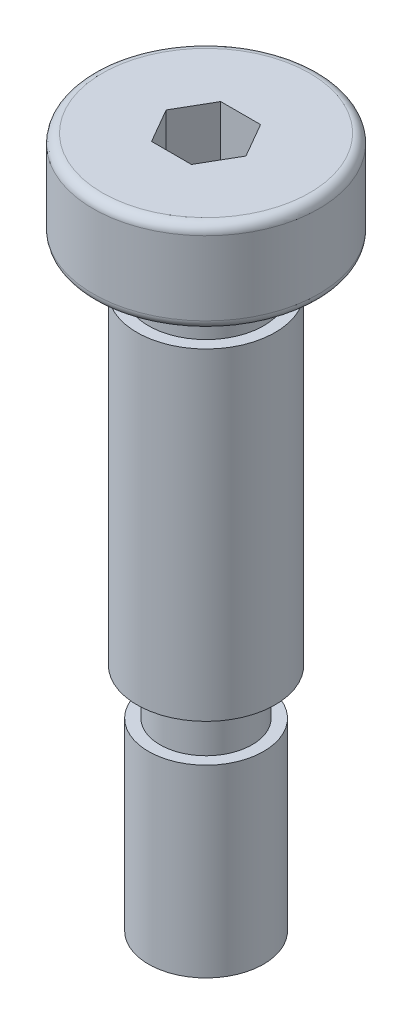
ISO-10303-21;
HEADER;
FILE_DESCRIPTION(('STEP AP214'),'2;1');
FILE_NAME('part.step','',(''),(''),'','','');
FILE_SCHEMA(('AUTOMOTIVE_DESIGN { 1 0 10303 214 1 1 1 1 }'));
ENDSEC;
DATA;
#1=APPLICATION_CONTEXT('core data for automotive mechanical design processes');
#2=APPLICATION_PROTOCOL_DEFINITION('international standard','automotive_design',2000,#1);
#3=PRODUCT_CONTEXT('',#1,'mechanical');
#4=PRODUCT('Part','Part','',(#3));
#5=PRODUCT_RELATED_PRODUCT_CATEGORY('part','',(#4));
#6=PRODUCT_DEFINITION_FORMATION('','',#4);
#7=PRODUCT_DEFINITION_CONTEXT('part definition',#1,'design');
#8=PRODUCT_DEFINITION('design','',#6,#7);
#9=PRODUCT_DEFINITION_SHAPE('','',#8);
#10=(LENGTH_UNIT() NAMED_UNIT(*) SI_UNIT(.MILLI.,.METRE.));
#11=(NAMED_UNIT(*) PLANE_ANGLE_UNIT() SI_UNIT($,.RADIAN.));
#12=(NAMED_UNIT(*) SI_UNIT($,.STERADIAN.) SOLID_ANGLE_UNIT());
#13=UNCERTAINTY_MEASURE_WITH_UNIT(LENGTH_MEASURE(1.E-05),#10,'distance_accuracy_value','');
#14=(GEOMETRIC_REPRESENTATION_CONTEXT(3) GLOBAL_UNCERTAINTY_ASSIGNED_CONTEXT((#13)) GLOBAL_UNIT_ASSIGNED_CONTEXT((#10,
#11,#12)) REPRESENTATION_CONTEXT('',''));
#15=CARTESIAN_POINT('',(0.,0.,0.));
#16=DIRECTION('',(0.,0.,1.));
#17=DIRECTION('',(1.,0.,0.));
#18=AXIS2_PLACEMENT_3D('',#15,#16,#17);
#19=CARTESIAN_POINT('',(0.,30.,0.));
#20=DIRECTION('',(0.,-1.,0.));
#21=DIRECTION('',(0.,0.,-1.));
#22=AXIS2_PLACEMENT_3D('',#19,#20,#21);
#23=PLANE('',#22);
#24=DIRECTION('',(-1.,0.,0.));
#25=VECTOR('',#24,1.);
#26=CARTESIAN_POINT('',(0.866025403784438,30.,-1.5));
#27=LINE('',#26,#25);
#28=CARTESIAN_POINT('',(0.866025403784438,30.,-1.5));
#29=VERTEX_POINT('',#28);
#30=CARTESIAN_POINT('',(-0.866025403784439,30.,-1.5));
#31=VERTEX_POINT('',#30);
#32=EDGE_CURVE('E124',#29,#31,#27,.T.);
#33=ORIENTED_EDGE('',*,*,#32,.F.);
#34=DIRECTION('',(-0.5,0.,-0.866025403784438));
#35=VECTOR('',#34,1.);
#36=CARTESIAN_POINT('',(1.73205080756888,30.,0.));
#37=LINE('',#36,#35);
#38=CARTESIAN_POINT('',(1.73205080756888,30.,0.));
#39=VERTEX_POINT('',#38);
#40=EDGE_CURVE('E50',#39,#29,#37,.T.);
#41=ORIENTED_EDGE('',*,*,#40,.F.);
#42=DIRECTION('',(0.5,0.,-0.866025403784438));
#43=VECTOR('',#42,1.);
#44=CARTESIAN_POINT('',(0.866025403784438,30.,1.5));
#45=LINE('',#44,#43);
#46=CARTESIAN_POINT('',(0.866025403784438,30.,1.5));
#47=VERTEX_POINT('',#46);
#48=EDGE_CURVE('E133',#47,#39,#45,.T.);
#49=ORIENTED_EDGE('',*,*,#48,.F.);
#50=DIRECTION('',(1.,0.,0.));
#51=VECTOR('',#50,1.);
#52=CARTESIAN_POINT('',(-0.866025403784439,30.,1.5));
#53=LINE('',#52,#51);
#54=CARTESIAN_POINT('',(-0.866025403784439,30.,1.5));
#55=VERTEX_POINT('',#54);
#56=EDGE_CURVE('E131',#55,#47,#53,.T.);
#57=ORIENTED_EDGE('',*,*,#56,.F.);
#58=DIRECTION('',(0.5,0.,0.866025403784439));
#59=VECTOR('',#58,1.);
#60=CARTESIAN_POINT('',(-1.73205080756888,30.,0.));
#61=LINE('',#60,#59);
#62=CARTESIAN_POINT('',(-1.73205080756888,30.,0.));
#63=VERTEX_POINT('',#62);
#64=EDGE_CURVE('E98',#63,#55,#61,.T.);
#65=ORIENTED_EDGE('',*,*,#64,.F.);
#66=DIRECTION('',(-0.5,0.,0.866025403784439));
#67=VECTOR('',#66,1.);
#68=CARTESIAN_POINT('',(-0.866025403784439,30.,-1.5));
#69=LINE('',#68,#67);
#70=EDGE_CURVE('E127',#31,#63,#69,.T.);
#71=ORIENTED_EDGE('',*,*,#70,.F.);
#72=EDGE_LOOP('',(#33,#41,#49,#57,#65,#71));
#73=FACE_BOUND('',#72,.T.);
#74=CARTESIAN_POINT('',(0.,30.,0.));
#75=DIRECTION('',(0.,-1.,0.));
#76=DIRECTION('',(0.,0.,-1.));
#77=AXIS2_PLACEMENT_3D('',#74,#75,#76);
#78=CIRCLE('',#77,4.5);
#79=CARTESIAN_POINT('',(0.,30.,-4.5));
#80=VERTEX_POINT('',#79);
#81=EDGE_CURVE('E11',#80,#80,#78,.T.);
#82=ORIENTED_EDGE('',*,*,#81,.F.);
#83=EDGE_LOOP('',(#82));
#84=FACE_BOUND('',#83,.T.);
#85=ADVANCED_FACE('F36',(#73,#84),#23,.F.);
#86=CARTESIAN_POINT('',(0.,29.6,0.));
#87=DIRECTION('',(0.,-1.,0.));
#88=DIRECTION('',(0.,0.,-1.));
#89=AXIS2_PLACEMENT_3D('',#86,#87,#88);
#90=TOROIDAL_SURFACE('',#89,4.5,0.400000000000001);
#91=CARTESIAN_POINT('',(0.,29.6,0.));
#92=DIRECTION('',(0.,-1.,0.));
#93=DIRECTION('',(0.,0.,-1.));
#94=AXIS2_PLACEMENT_3D('',#91,#92,#93);
#95=CIRCLE('',#94,4.9);
#96=CARTESIAN_POINT('',(0.,29.6,-4.9));
#97=VERTEX_POINT('',#96);
#98=EDGE_CURVE('E43',#97,#97,#95,.T.);
#99=ORIENTED_EDGE('',*,*,#98,.F.);
#100=EDGE_LOOP('',(#99));
#101=FACE_BOUND('',#100,.T.);
#102=ORIENTED_EDGE('',*,*,#81,.T.);
#103=EDGE_LOOP('',(#102));
#104=FACE_BOUND('',#103,.T.);
#105=ADVANCED_FACE('F176',(#101,#104),#90,.T.);
#106=CARTESIAN_POINT('',(0.,0.,0.));
#107=DIRECTION('',(0.,-1.,0.));
#108=DIRECTION('',(0.,0.,-1.));
#109=AXIS2_PLACEMENT_3D('',#106,#107,#108);
#110=CYLINDRICAL_SURFACE('',#109,4.9);
#111=CARTESIAN_POINT('',(0.,26.4,0.));
#112=DIRECTION('',(0.,-1.,0.));
#113=DIRECTION('',(0.,0.,-1.));
#114=AXIS2_PLACEMENT_3D('',#111,#112,#113);
#115=CIRCLE('',#114,4.9);
#116=CARTESIAN_POINT('',(0.,26.4,-4.9));
#117=VERTEX_POINT('',#116);
#118=EDGE_CURVE('E169',#117,#117,#115,.T.);
#119=ORIENTED_EDGE('',*,*,#118,.F.);
#120=EDGE_LOOP('',(#119));
#121=FACE_BOUND('',#120,.T.);
#122=ORIENTED_EDGE('',*,*,#98,.T.);
#123=EDGE_LOOP('',(#122));
#124=FACE_BOUND('',#123,.T.);
#125=ADVANCED_FACE('F174',(#121,#124),#110,.T.);
#126=CARTESIAN_POINT('',(0.,26.4,0.));
#127=DIRECTION('',(0.,-1.,0.));
#128=DIRECTION('',(0.,0.,-1.));
#129=AXIS2_PLACEMENT_3D('',#126,#127,#128);
#130=TOROIDAL_SURFACE('',#129,4.5,0.400000000000004);
#131=CARTESIAN_POINT('',(0.,26.,0.));
#132=DIRECTION('',(0.,-1.,0.));
#133=DIRECTION('',(0.,0.,-1.));
#134=AXIS2_PLACEMENT_3D('',#131,#132,#133);
#135=CIRCLE('',#134,4.5);
#136=CARTESIAN_POINT('',(0.,26.,-4.5));
#137=VERTEX_POINT('',#136);
#138=EDGE_CURVE('E166',#137,#137,#135,.T.);
#139=ORIENTED_EDGE('',*,*,#138,.F.);
#140=EDGE_LOOP('',(#139));
#141=FACE_BOUND('',#140,.T.);
#142=ORIENTED_EDGE('',*,*,#118,.T.);
#143=EDGE_LOOP('',(#142));
#144=FACE_BOUND('',#143,.T.);
#145=ADVANCED_FACE('F237',(#141,#144),#130,.T.);
#146=CARTESIAN_POINT('',(-4.5,26.,0.));
#147=DIRECTION('',(0.,1.,0.));
#148=DIRECTION('',(0.,0.,1.));
#149=AXIS2_PLACEMENT_3D('',#146,#147,#148);
#150=PLANE('',#149);
#151=CARTESIAN_POINT('',(0.,26.,0.));
#152=DIRECTION('',(0.,-1.,0.));
#153=DIRECTION('',(0.,0.,-1.));
#154=AXIS2_PLACEMENT_3D('',#151,#152,#153);
#155=CIRCLE('',#154,2.5);
#156=CARTESIAN_POINT('',(0.,26.,-2.5));
#157=VERTEX_POINT('',#156);
#158=EDGE_CURVE('E163',#157,#157,#155,.T.);
#159=ORIENTED_EDGE('',*,*,#158,.F.);
#160=EDGE_LOOP('',(#159));
#161=FACE_BOUND('',#160,.T.);
#162=ORIENTED_EDGE('',*,*,#138,.T.);
#163=EDGE_LOOP('',(#162));
#164=FACE_BOUND('',#163,.T.);
#165=ADVANCED_FACE('F233',(#161,#164),#150,.F.);
#166=CARTESIAN_POINT('',(0.,0.,0.));
#167=DIRECTION('',(0.,-1.,0.));
#168=DIRECTION('',(0.,0.,-1.));
#169=AXIS2_PLACEMENT_3D('',#166,#167,#168);
#170=CYLINDRICAL_SURFACE('',#169,2.5);
#171=CARTESIAN_POINT('',(0.,24.,0.));
#172=DIRECTION('',(0.,-1.,0.));
#173=DIRECTION('',(0.,0.,-1.));
#174=AXIS2_PLACEMENT_3D('',#171,#172,#173);
#175=CIRCLE('',#174,2.5);
#176=CARTESIAN_POINT('',(0.,24.,-2.5));
#177=VERTEX_POINT('',#176);
#178=EDGE_CURVE('E160',#177,#177,#175,.T.);
#179=ORIENTED_EDGE('',*,*,#178,.F.);
#180=EDGE_LOOP('',(#179));
#181=FACE_BOUND('',#180,.T.);
#182=ORIENTED_EDGE('',*,*,#158,.T.);
#183=EDGE_LOOP('',(#182));
#184=FACE_BOUND('',#183,.T.);
#185=ADVANCED_FACE('F229',(#181,#184),#170,.T.);
#186=CARTESIAN_POINT('',(-2.5,24.,0.));
#187=DIRECTION('',(0.,-1.,0.));
#188=DIRECTION('',(0.,0.,-1.));
#189=AXIS2_PLACEMENT_3D('',#186,#187,#188);
#190=PLANE('',#189);
#191=CARTESIAN_POINT('',(0.,24.,0.));
#192=DIRECTION('',(0.,-1.,0.));
#193=DIRECTION('',(0.,0.,-1.));
#194=AXIS2_PLACEMENT_3D('',#191,#192,#193);
#195=CIRCLE('',#194,3.);
#196=CARTESIAN_POINT('',(0.,24.,-3.));
#197=VERTEX_POINT('',#196);
#198=EDGE_CURVE('E157',#197,#197,#195,.T.);
#199=ORIENTED_EDGE('',*,*,#198,.F.);
#200=EDGE_LOOP('',(#199));
#201=FACE_BOUND('',#200,.T.);
#202=ORIENTED_EDGE('',*,*,#178,.T.);
#203=EDGE_LOOP('',(#202));
#204=FACE_BOUND('',#203,.T.);
#205=ADVANCED_FACE('F225',(#201,#204),#190,.F.);
#206=CARTESIAN_POINT('',(0.,0.,0.));
#207=DIRECTION('',(0.,-1.,0.));
#208=DIRECTION('',(0.,0.,-1.));
#209=AXIS2_PLACEMENT_3D('',#206,#207,#208);
#210=CYLINDRICAL_SURFACE('',#209,3.);
#211=CARTESIAN_POINT('',(0.,10.,0.));
#212=DIRECTION('',(0.,-1.,0.));
#213=DIRECTION('',(0.,0.,-1.));
#214=AXIS2_PLACEMENT_3D('',#211,#212,#213);
#215=CIRCLE('',#214,3.);
#216=CARTESIAN_POINT('',(0.,10.,-3.));
#217=VERTEX_POINT('',#216);
#218=EDGE_CURVE('E154',#217,#217,#215,.T.);
#219=ORIENTED_EDGE('',*,*,#218,.F.);
#220=EDGE_LOOP('',(#219));
#221=FACE_BOUND('',#220,.T.);
#222=ORIENTED_EDGE('',*,*,#198,.T.);
#223=EDGE_LOOP('',(#222));
#224=FACE_BOUND('',#223,.T.);
#225=ADVANCED_FACE('F221',(#221,#224),#210,.T.);
#226=CARTESIAN_POINT('',(-3.,10.,0.));
#227=DIRECTION('',(0.,1.,0.));
#228=DIRECTION('',(0.,0.,1.));
#229=AXIS2_PLACEMENT_3D('',#226,#227,#228);
#230=PLANE('',#229);
#231=CARTESIAN_POINT('',(0.,10.,0.));
#232=DIRECTION('',(0.,-1.,0.));
#233=DIRECTION('',(0.,0.,-1.));
#234=AXIS2_PLACEMENT_3D('',#231,#232,#233);
#235=CIRCLE('',#234,2.);
#236=CARTESIAN_POINT('',(0.,10.,-2.));
#237=VERTEX_POINT('',#236);
#238=EDGE_CURVE('E151',#237,#237,#235,.T.);
#239=ORIENTED_EDGE('',*,*,#238,.F.);
#240=EDGE_LOOP('',(#239));
#241=FACE_BOUND('',#240,.T.);
#242=ORIENTED_EDGE('',*,*,#218,.T.);
#243=EDGE_LOOP('',(#242));
#244=FACE_BOUND('',#243,.T.);
#245=ADVANCED_FACE('F217',(#241,#244),#230,.F.);
#246=CARTESIAN_POINT('',(0.,0.,0.));
#247=DIRECTION('',(0.,-1.,0.));
#248=DIRECTION('',(0.,0.,-1.));
#249=AXIS2_PLACEMENT_3D('',#246,#247,#248);
#250=CYLINDRICAL_SURFACE('',#249,2.);
#251=CARTESIAN_POINT('',(0.,8.,0.));
#252=DIRECTION('',(0.,-1.,0.));
#253=DIRECTION('',(0.,0.,-1.));
#254=AXIS2_PLACEMENT_3D('',#251,#252,#253);
#255=CIRCLE('',#254,2.);
#256=CARTESIAN_POINT('',(0.,8.,-2.));
#257=VERTEX_POINT('',#256);
#258=EDGE_CURVE('E148',#257,#257,#255,.T.);
#259=ORIENTED_EDGE('',*,*,#258,.F.);
#260=EDGE_LOOP('',(#259));
#261=FACE_BOUND('',#260,.T.);
#262=ORIENTED_EDGE('',*,*,#238,.T.);
#263=EDGE_LOOP('',(#262));
#264=FACE_BOUND('',#263,.T.);
#265=ADVANCED_FACE('F213',(#261,#264),#250,.T.);
#266=CARTESIAN_POINT('',(-2.,8.,0.));
#267=DIRECTION('',(0.,-1.,0.));
#268=DIRECTION('',(0.,0.,-1.));
#269=AXIS2_PLACEMENT_3D('',#266,#267,#268);
#270=PLANE('',#269);
#271=CARTESIAN_POINT('',(0.,8.,0.));
#272=DIRECTION('',(0.,-1.,0.));
#273=DIRECTION('',(0.,0.,-1.));
#274=AXIS2_PLACEMENT_3D('',#271,#272,#273);
#275=CIRCLE('',#274,2.5);
#276=CARTESIAN_POINT('',(0.,8.,-2.5));
#277=VERTEX_POINT('',#276);
#278=EDGE_CURVE('E145',#277,#277,#275,.T.);
#279=ORIENTED_EDGE('',*,*,#278,.F.);
#280=EDGE_LOOP('',(#279));
#281=FACE_BOUND('',#280,.T.);
#282=ORIENTED_EDGE('',*,*,#258,.T.);
#283=EDGE_LOOP('',(#282));
#284=FACE_BOUND('',#283,.T.);
#285=ADVANCED_FACE('F209',(#281,#284),#270,.F.);
#286=CARTESIAN_POINT('',(0.,0.,0.));
#287=DIRECTION('',(0.,-1.,0.));
#288=DIRECTION('',(0.,0.,-1.));
#289=AXIS2_PLACEMENT_3D('',#286,#287,#288);
#290=CYLINDRICAL_SURFACE('',#289,2.5);
#291=CARTESIAN_POINT('',(0.,0.,0.));
#292=DIRECTION('',(0.,-1.,0.));
#293=DIRECTION('',(0.,0.,-1.));
#294=AXIS2_PLACEMENT_3D('',#291,#292,#293);
#295=CIRCLE('',#294,2.5);
#296=CARTESIAN_POINT('',(0.,0.,-2.5));
#297=VERTEX_POINT('',#296);
#298=EDGE_CURVE('E137',#297,#297,#295,.T.);
#299=ORIENTED_EDGE('',*,*,#298,.F.);
#300=EDGE_LOOP('',(#299));
#301=FACE_BOUND('',#300,.T.);
#302=ORIENTED_EDGE('',*,*,#278,.T.);
#303=EDGE_LOOP('',(#302));
#304=FACE_BOUND('',#303,.T.);
#305=ADVANCED_FACE('F201',(#301,#304),#290,.T.);
#306=CARTESIAN_POINT('',(-2.5,0.,0.));
#307=DIRECTION('',(0.,1.,0.));
#308=DIRECTION('',(0.,0.,1.));
#309=AXIS2_PLACEMENT_3D('',#306,#307,#308);
#310=PLANE('',#309);
#311=ORIENTED_EDGE('',*,*,#298,.T.);
#312=EDGE_LOOP('',(#311));
#313=FACE_BOUND('',#312,.T.);
#314=ADVANCED_FACE('F194',(#313),#310,.F.);
#315=CARTESIAN_POINT('',(1.73205080756888,26.5,0.));
#316=DIRECTION('',(0.866025403784438,0.,-0.5));
#317=DIRECTION('',(-0.5,0.,-0.866025403784439));
#318=AXIS2_PLACEMENT_3D('',#315,#316,#317);
#319=PLANE('',#318);
#320=ORIENTED_EDGE('',*,*,#40,.T.);
#321=DIRECTION('',(0.,1.,0.));
#322=VECTOR('',#321,1.);
#323=CARTESIAN_POINT('',(0.866025403784438,26.5,-1.5));
#324=LINE('',#323,#322);
#325=CARTESIAN_POINT('',(0.866025403784438,26.5,-1.5));
#326=VERTEX_POINT('',#325);
#327=EDGE_CURVE('E80',#326,#29,#324,.T.);
#328=ORIENTED_EDGE('',*,*,#327,.F.);
#329=DIRECTION('',(-0.5,0.,-0.866025403784438));
#330=VECTOR('',#329,1.);
#331=CARTESIAN_POINT('',(1.73205080756888,26.5,0.));
#332=LINE('',#331,#330);
#333=CARTESIAN_POINT('',(1.73205080756888,26.5,0.));
#334=VERTEX_POINT('',#333);
#335=EDGE_CURVE('E135',#334,#326,#332,.T.);
#336=ORIENTED_EDGE('',*,*,#335,.F.);
#337=DIRECTION('',(0.,1.,0.));
#338=VECTOR('',#337,1.);
#339=CARTESIAN_POINT('',(1.73205080756888,26.5,0.));
#340=LINE('',#339,#338);
#341=EDGE_CURVE('E58',#334,#39,#340,.T.);
#342=ORIENTED_EDGE('',*,*,#341,.T.);
#343=EDGE_LOOP('',(#320,#328,#336,#342));
#344=FACE_BOUND('',#343,.T.);
#345=ADVANCED_FACE('F191',(#344),#319,.F.);
#346=CARTESIAN_POINT('',(0.866025403784438,26.5,1.5));
#347=DIRECTION('',(0.866025403784438,0.,0.5));
#348=DIRECTION('',(0.5,0.,-0.866025403784439));
#349=AXIS2_PLACEMENT_3D('',#346,#347,#348);
#350=PLANE('',#349);
#351=ORIENTED_EDGE('',*,*,#48,.T.);
#352=ORIENTED_EDGE('',*,*,#341,.F.);
#353=DIRECTION('',(0.5,0.,-0.866025403784438));
#354=VECTOR('',#353,1.);
#355=CARTESIAN_POINT('',(0.866025403784438,26.5,1.5));
#356=LINE('',#355,#354);
#357=CARTESIAN_POINT('',(0.866025403784438,26.5,1.5));
#358=VERTEX_POINT('',#357);
#359=EDGE_CURVE('E110',#358,#334,#356,.T.);
#360=ORIENTED_EDGE('',*,*,#359,.F.);
#361=DIRECTION('',(0.,1.,0.));
#362=VECTOR('',#361,1.);
#363=CARTESIAN_POINT('',(0.866025403784438,26.5,1.5));
#364=LINE('',#363,#362);
#365=EDGE_CURVE('E102',#358,#47,#364,.T.);
#366=ORIENTED_EDGE('',*,*,#365,.T.);
#367=EDGE_LOOP('',(#351,#352,#360,#366));
#368=FACE_BOUND('',#367,.T.);
#369=ADVANCED_FACE('F193',(#368),#350,.F.);
#370=CARTESIAN_POINT('',(-0.866025403784439,26.5,1.5));
#371=DIRECTION('',(0.,0.,1.));
#372=DIRECTION('',(1.,0.,0.));
#373=AXIS2_PLACEMENT_3D('',#370,#371,#372);
#374=PLANE('',#373);
#375=ORIENTED_EDGE('',*,*,#56,.T.);
#376=ORIENTED_EDGE('',*,*,#365,.F.);
#377=DIRECTION('',(1.,0.,0.));
#378=VECTOR('',#377,1.);
#379=CARTESIAN_POINT('',(-0.866025403784439,26.5,1.5));
#380=LINE('',#379,#378);
#381=CARTESIAN_POINT('',(-0.866025403784439,26.5,1.5));
#382=VERTEX_POINT('',#381);
#383=EDGE_CURVE('E106',#382,#358,#380,.T.);
#384=ORIENTED_EDGE('',*,*,#383,.F.);
#385=DIRECTION('',(0.,1.,0.));
#386=VECTOR('',#385,1.);
#387=CARTESIAN_POINT('',(-0.866025403784439,26.5,1.5));
#388=LINE('',#387,#386);
#389=EDGE_CURVE('E91',#382,#55,#388,.T.);
#390=ORIENTED_EDGE('',*,*,#389,.T.);
#391=EDGE_LOOP('',(#375,#376,#384,#390));
#392=FACE_BOUND('',#391,.T.);
#393=ADVANCED_FACE('F107',(#392),#374,.F.);
#394=CARTESIAN_POINT('',(-1.73205080756888,26.5,0.));
#395=DIRECTION('',(-0.866025403784439,0.,0.5));
#396=DIRECTION('',(0.5,0.,0.866025403784439));
#397=AXIS2_PLACEMENT_3D('',#394,#395,#396);
#398=PLANE('',#397);
#399=ORIENTED_EDGE('',*,*,#64,.T.);
#400=ORIENTED_EDGE('',*,*,#389,.F.);
#401=DIRECTION('',(0.5,0.,0.866025403784439));
#402=VECTOR('',#401,1.);
#403=CARTESIAN_POINT('',(-1.73205080756888,26.5,0.));
#404=LINE('',#403,#402);
#405=CARTESIAN_POINT('',(-1.73205080756888,26.5,0.));
#406=VERTEX_POINT('',#405);
#407=EDGE_CURVE('E95',#406,#382,#404,.T.);
#408=ORIENTED_EDGE('',*,*,#407,.F.);
#409=DIRECTION('',(0.,1.,0.));
#410=VECTOR('',#409,1.);
#411=CARTESIAN_POINT('',(-1.73205080756888,26.5,0.));
#412=LINE('',#411,#410);
#413=EDGE_CURVE('E103',#406,#63,#412,.T.);
#414=ORIENTED_EDGE('',*,*,#413,.T.);
#415=EDGE_LOOP('',(#399,#400,#408,#414));
#416=FACE_BOUND('',#415,.T.);
#417=ADVANCED_FACE('F93',(#416),#398,.F.);
#418=CARTESIAN_POINT('',(-0.866025403784439,26.5,-1.5));
#419=DIRECTION('',(-0.866025403784439,0.,-0.5));
#420=DIRECTION('',(-0.5,0.,0.866025403784439));
#421=AXIS2_PLACEMENT_3D('',#418,#419,#420);
#422=PLANE('',#421);
#423=ORIENTED_EDGE('',*,*,#70,.T.);
#424=ORIENTED_EDGE('',*,*,#413,.F.);
#425=DIRECTION('',(-0.5,0.,0.866025403784439));
#426=VECTOR('',#425,1.);
#427=CARTESIAN_POINT('',(-0.866025403784439,26.5,-1.5));
#428=LINE('',#427,#426);
#429=CARTESIAN_POINT('',(-0.866025403784439,26.5,-1.5));
#430=VERTEX_POINT('',#429);
#431=EDGE_CURVE('E116',#430,#406,#428,.T.);
#432=ORIENTED_EDGE('',*,*,#431,.F.);
#433=DIRECTION('',(0.,1.,0.));
#434=VECTOR('',#433,1.);
#435=CARTESIAN_POINT('',(-0.866025403784439,26.5,-1.5));
#436=LINE('',#435,#434);
#437=EDGE_CURVE('E140',#430,#31,#436,.T.);
#438=ORIENTED_EDGE('',*,*,#437,.T.);
#439=EDGE_LOOP('',(#423,#424,#432,#438));
#440=FACE_BOUND('',#439,.T.);
#441=ADVANCED_FACE('F324',(#440),#422,.F.);
#442=CARTESIAN_POINT('',(0.866025403784438,26.5,-1.5));
#443=DIRECTION('',(0.,0.,-1.));
#444=DIRECTION('',(-1.,0.,0.));
#445=AXIS2_PLACEMENT_3D('',#442,#443,#444);
#446=PLANE('',#445);
#447=ORIENTED_EDGE('',*,*,#32,.T.);
#448=ORIENTED_EDGE('',*,*,#437,.F.);
#449=DIRECTION('',(-1.,0.,0.));
#450=VECTOR('',#449,1.);
#451=CARTESIAN_POINT('',(0.866025403784438,26.5,-1.5));
#452=LINE('',#451,#450);
#453=EDGE_CURVE('E118',#326,#430,#452,.T.);
#454=ORIENTED_EDGE('',*,*,#453,.F.);
#455=ORIENTED_EDGE('',*,*,#327,.T.);
#456=EDGE_LOOP('',(#447,#448,#454,#455));
#457=FACE_BOUND('',#456,.T.);
#458=ADVANCED_FACE('F189',(#457),#446,.F.);
#459=CARTESIAN_POINT('',(0.,26.5,0.));
#460=DIRECTION('',(0.,1.,0.));
#461=DIRECTION('',(0.,0.,1.));
#462=AXIS2_PLACEMENT_3D('',#459,#460,#461);
#463=PLANE('',#462);
#464=ORIENTED_EDGE('',*,*,#335,.T.);
#465=ORIENTED_EDGE('',*,*,#453,.T.);
#466=ORIENTED_EDGE('',*,*,#431,.T.);
#467=ORIENTED_EDGE('',*,*,#407,.T.);
#468=ORIENTED_EDGE('',*,*,#383,.T.);
#469=ORIENTED_EDGE('',*,*,#359,.T.);
#470=EDGE_LOOP('',(#464,#465,#466,#467,#468,#469));
#471=FACE_BOUND('',#470,.T.);
#472=ADVANCED_FACE('F113',(#471),#463,.T.);
#473=CLOSED_SHELL('',(#85,#105,#125,#145,#165,#185,#205,#225,#245,#265,#285,#305,#314,#345,#369,
#393,#417,#441,#458,#472));
#474=MANIFOLD_SOLID_BREP('B2',#473);
#475=ADVANCED_BREP_SHAPE_REPRESENTATION('',(#18,#474),#14);
#476=SHAPE_DEFINITION_REPRESENTATION(#9,#475);
ENDSEC;
END-ISO-10303-21;
